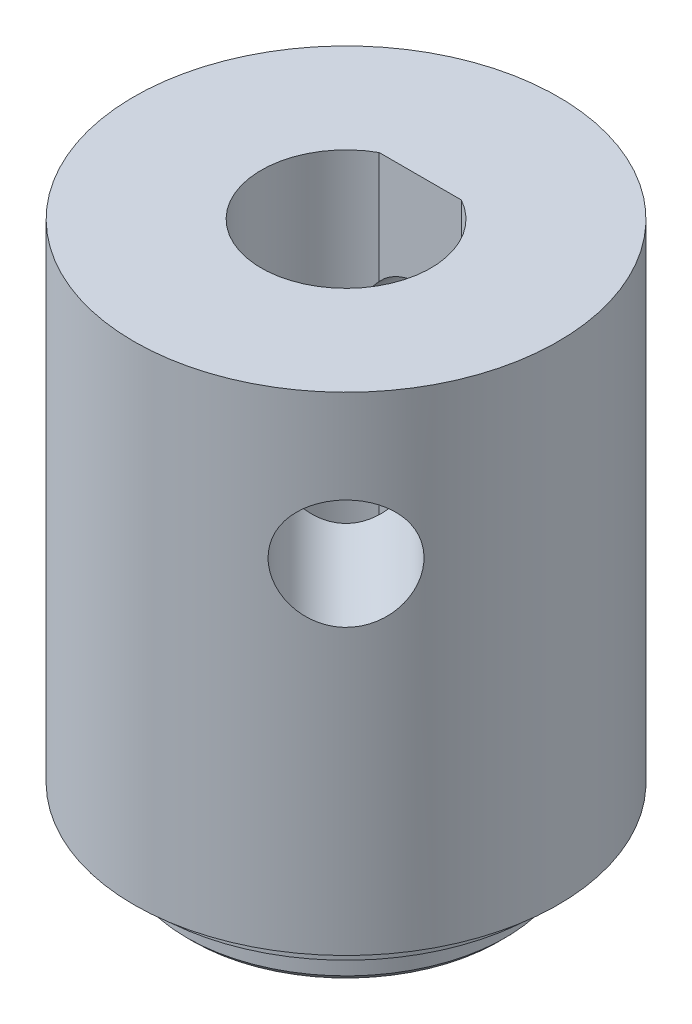
ISO-10303-21;
HEADER;
FILE_DESCRIPTION(('STEP AP214'),'2;1');
FILE_NAME('part.step','',(''),(''),'','','');
FILE_SCHEMA(('AUTOMOTIVE_DESIGN { 1 0 10303 214 1 1 1 1 }'));
ENDSEC;
DATA;
#1=APPLICATION_CONTEXT('core data for automotive mechanical design processes');
#2=APPLICATION_PROTOCOL_DEFINITION('international standard','automotive_design',2000,#1);
#3=PRODUCT_CONTEXT('',#1,'mechanical');
#4=PRODUCT('Part','Part','',(#3));
#5=PRODUCT_RELATED_PRODUCT_CATEGORY('part','',(#4));
#6=PRODUCT_DEFINITION_FORMATION('','',#4);
#7=PRODUCT_DEFINITION_CONTEXT('part definition',#1,'design');
#8=PRODUCT_DEFINITION('design','',#6,#7);
#9=PRODUCT_DEFINITION_SHAPE('','',#8);
#10=(LENGTH_UNIT() NAMED_UNIT(*) SI_UNIT(.MILLI.,.METRE.));
#11=(NAMED_UNIT(*) PLANE_ANGLE_UNIT() SI_UNIT($,.RADIAN.));
#12=(NAMED_UNIT(*) SI_UNIT($,.STERADIAN.) SOLID_ANGLE_UNIT());
#13=UNCERTAINTY_MEASURE_WITH_UNIT(LENGTH_MEASURE(1.E-05),#10,'distance_accuracy_value','');
#14=(GEOMETRIC_REPRESENTATION_CONTEXT(3) GLOBAL_UNCERTAINTY_ASSIGNED_CONTEXT((#13)) GLOBAL_UNIT_ASSIGNED_CONTEXT((#10,
#11,#12)) REPRESENTATION_CONTEXT('',''));
#15=CARTESIAN_POINT('',(0.,0.,0.));
#16=DIRECTION('',(0.,0.,1.));
#17=DIRECTION('',(1.,0.,0.));
#18=AXIS2_PLACEMENT_3D('',#15,#16,#17);
#19=CARTESIAN_POINT('',(-1.93649167310371,5.9,-3.5));
#20=DIRECTION('',(0.,0.,-1.));
#21=DIRECTION('',(-1.,0.,0.));
#22=AXIS2_PLACEMENT_3D('',#19,#20,#21);
#23=PLANE('',#22);
#24=DIRECTION('',(0.,1.,0.));
#25=VECTOR('',#24,1.);
#26=CARTESIAN_POINT('',(-1.93649167310371,5.9,-3.5));
#27=LINE('',#26,#25);
#28=CARTESIAN_POINT('',(-1.93649167310371,20.6349351572897,-3.5));
#29=VERTEX_POINT('',#28);
#30=CARTESIAN_POINT('',(-1.93649167310371,25.9,-3.5));
#31=VERTEX_POINT('',#30);
#32=EDGE_CURVE('E99',#29,#31,#27,.T.);
#33=ORIENTED_EDGE('',*,*,#32,.F.);
#34=CARTESIAN_POINT('',(0.,18.9,-3.5));
#35=DIRECTION('',(0.,0.,-1.));
#36=DIRECTION('',(-1.,0.,0.));
#37=AXIS2_PLACEMENT_3D('',#34,#35,#36);
#38=CIRCLE('',#37,2.6);
#39=CARTESIAN_POINT('',(1.93649167310371,20.6349351572897,-3.5));
#40=VERTEX_POINT('',#39);
#41=EDGE_CURVE('E85',#29,#40,#38,.T.);
#42=ORIENTED_EDGE('',*,*,#41,.T.);
#43=DIRECTION('',(0.,1.,0.));
#44=VECTOR('',#43,1.);
#45=CARTESIAN_POINT('',(1.93649167310371,5.9,-3.5));
#46=LINE('',#45,#44);
#47=CARTESIAN_POINT('',(1.93649167310371,25.9,-3.5));
#48=VERTEX_POINT('',#47);
#49=EDGE_CURVE('E60',#40,#48,#46,.T.);
#50=ORIENTED_EDGE('',*,*,#49,.T.);
#51=DIRECTION('',(-1.,0.,0.));
#52=VECTOR('',#51,1.);
#53=CARTESIAN_POINT('',(-1.93649167310371,25.9,-3.5));
#54=LINE('',#53,#52);
#55=EDGE_CURVE('E259',#48,#31,#54,.T.);
#56=ORIENTED_EDGE('',*,*,#55,.T.);
#57=EDGE_LOOP('',(#33,#42,#50,#56));
#58=FACE_BOUND('',#57,.T.);
#59=ADVANCED_FACE('F36',(#58),#23,.F.);
#60=CARTESIAN_POINT('',(0.,2.,0.));
#61=DIRECTION('',(0.,-1.,0.));
#62=DIRECTION('',(0.,0.,-1.));
#63=AXIS2_PLACEMENT_3D('',#60,#61,#62);
#64=CYLINDRICAL_SURFACE('',#63,7.5);
#65=CARTESIAN_POINT('',(0.,0.300000000000003,0.));
#66=DIRECTION('',(0.,1.,0.));
#67=DIRECTION('',(0.,0.,1.));
#68=AXIS2_PLACEMENT_3D('',#65,#66,#67);
#69=CIRCLE('',#68,7.5);
#70=CARTESIAN_POINT('',(0.,0.300000000000003,7.5));
#71=VERTEX_POINT('',#70);
#72=EDGE_CURVE('E45',#71,#71,#69,.T.);
#73=ORIENTED_EDGE('',*,*,#72,.T.);
#74=EDGE_LOOP('',(#73));
#75=FACE_BOUND('',#74,.T.);
#76=CARTESIAN_POINT('',(0.,2.,0.));
#77=DIRECTION('',(0.,1.,0.));
#78=DIRECTION('',(0.,0.,1.));
#79=AXIS2_PLACEMENT_3D('',#76,#77,#78);
#80=CIRCLE('',#79,7.5);
#81=CARTESIAN_POINT('',(0.,2.,7.5));
#82=VERTEX_POINT('',#81);
#83=EDGE_CURVE('E86',#82,#82,#80,.T.);
#84=ORIENTED_EDGE('',*,*,#83,.F.);
#85=EDGE_LOOP('',(#84));
#86=FACE_BOUND('',#85,.T.);
#87=ADVANCED_FACE('F205',(#75,#86),#64,.T.);
#88=CARTESIAN_POINT('',(0.,0.,0.));
#89=DIRECTION('',(0.,1.,0.));
#90=DIRECTION('',(0.,0.,1.));
#91=AXIS2_PLACEMENT_3D('',#88,#89,#90);
#92=PLANE('',#91);
#93=CARTESIAN_POINT('',(0.,0.,0.));
#94=DIRECTION('',(0.,1.,0.));
#95=DIRECTION('',(0.,0.,1.));
#96=AXIS2_PLACEMENT_3D('',#93,#94,#95);
#97=CIRCLE('',#96,7.2);
#98=CARTESIAN_POINT('',(0.,0.,7.2));
#99=VERTEX_POINT('',#98);
#100=EDGE_CURVE('E11',#99,#99,#97,.F.);
#101=ORIENTED_EDGE('',*,*,#100,.T.);
#102=EDGE_LOOP('',(#101));
#103=FACE_BOUND('',#102,.T.);
#104=CARTESIAN_POINT('',(4.,0.,0.));
#105=DIRECTION('',(0.,-1.,0.));
#106=DIRECTION('',(0.,0.,-1.));
#107=AXIS2_PLACEMENT_3D('',#104,#105,#106);
#108=CIRCLE('',#107,2.1);
#109=CARTESIAN_POINT('',(4.,0.,-2.1));
#110=VERTEX_POINT('',#109);
#111=EDGE_CURVE('E109',#110,#110,#108,.T.);
#112=ORIENTED_EDGE('',*,*,#111,.F.);
#113=EDGE_LOOP('',(#112));
#114=FACE_BOUND('',#113,.T.);
#115=CARTESIAN_POINT('',(-2.,0.,-3.46410161513776));
#116=DIRECTION('',(0.,-1.,0.));
#117=DIRECTION('',(0.,0.,-1.));
#118=AXIS2_PLACEMENT_3D('',#115,#116,#117);
#119=CIRCLE('',#118,2.1);
#120=CARTESIAN_POINT('',(-2.,0.,-5.56410161513776));
#121=VERTEX_POINT('',#120);
#122=EDGE_CURVE('E115',#121,#121,#119,.T.);
#123=ORIENTED_EDGE('',*,*,#122,.F.);
#124=EDGE_LOOP('',(#123));
#125=FACE_BOUND('',#124,.T.);
#126=CARTESIAN_POINT('',(-2.,0.,3.46410161513775));
#127=DIRECTION('',(0.,-1.,0.));
#128=DIRECTION('',(0.,0.,-1.));
#129=AXIS2_PLACEMENT_3D('',#126,#127,#128);
#130=CIRCLE('',#129,2.1);
#131=CARTESIAN_POINT('',(-2.,0.,1.36410161513775));
#132=VERTEX_POINT('',#131);
#133=EDGE_CURVE('E121',#132,#132,#130,.T.);
#134=ORIENTED_EDGE('',*,*,#133,.F.);
#135=EDGE_LOOP('',(#134));
#136=FACE_BOUND('',#135,.T.);
#137=ADVANCED_FACE('F202',(#103,#114,#125,#136),#92,.F.);
#138=CARTESIAN_POINT('',(0.,2.9,0.));
#139=DIRECTION('',(0.,-1.,0.));
#140=DIRECTION('',(0.,0.,-1.));
#141=AXIS2_PLACEMENT_3D('',#138,#139,#140);
#142=CYLINDRICAL_SURFACE('',#141,9.);
#143=CARTESIAN_POINT('',(0.,2.9,0.));
#144=DIRECTION('',(0.,1.,0.));
#145=DIRECTION('',(0.,0.,1.));
#146=AXIS2_PLACEMENT_3D('',#143,#144,#145);
#147=CIRCLE('',#146,9.);
#148=CARTESIAN_POINT('',(0.,2.9,9.));
#149=VERTEX_POINT('',#148);
#150=EDGE_CURVE('E130',#149,#149,#147,.T.);
#151=ORIENTED_EDGE('',*,*,#150,.F.);
#152=EDGE_LOOP('',(#151));
#153=FACE_BOUND('',#152,.T.);
#154=CARTESIAN_POINT('',(0.,2.,0.));
#155=DIRECTION('',(0.,1.,0.));
#156=DIRECTION('',(0.,0.,1.));
#157=AXIS2_PLACEMENT_3D('',#154,#155,#156);
#158=CIRCLE('',#157,9.);
#159=CARTESIAN_POINT('',(0.,2.,9.));
#160=VERTEX_POINT('',#159);
#161=EDGE_CURVE('E127',#160,#160,#158,.T.);
#162=ORIENTED_EDGE('',*,*,#161,.T.);
#163=EDGE_LOOP('',(#162));
#164=FACE_BOUND('',#163,.T.);
#165=ADVANCED_FACE('F198',(#153,#164),#142,.T.);
#166=CARTESIAN_POINT('',(0.,2.,0.));
#167=DIRECTION('',(0.,1.,0.));
#168=DIRECTION('',(0.,0.,1.));
#169=AXIS2_PLACEMENT_3D('',#166,#167,#168);
#170=PLANE('',#169);
#171=ORIENTED_EDGE('',*,*,#83,.T.);
#172=EDGE_LOOP('',(#171));
#173=FACE_BOUND('',#172,.T.);
#174=ORIENTED_EDGE('',*,*,#161,.F.);
#175=EDGE_LOOP('',(#174));
#176=FACE_BOUND('',#175,.T.);
#177=ADVANCED_FACE('F192',(#173,#176),#170,.F.);
#178=CARTESIAN_POINT('',(0.,25.9,0.));
#179=DIRECTION('',(0.,-1.,0.));
#180=DIRECTION('',(0.,0.,-1.));
#181=AXIS2_PLACEMENT_3D('',#178,#179,#180);
#182=CYLINDRICAL_SURFACE('',#181,10.);
#183=CARTESIAN_POINT('',(7.07106781186544,21.5,7.07106781186551));
#184=CARTESIAN_POINT('',(7.17250883846086,21.4999963317231,6.96962355838698));
#185=CARTESIAN_POINT('',(7.27177679064812,21.4880863541353,6.86594971398938));
#186=CARTESIAN_POINT('',(7.46322731948612,21.4408401503296,6.65735069355482));
#187=CARTESIAN_POINT('',(7.55540621283121,21.4054918366635,6.55242489930377));
#188=CARTESIAN_POINT('',(7.73046634046129,21.3125893881236,6.34494306025288));
#189=CARTESIAN_POINT('',(7.81335906217048,21.2550630888212,6.24238421503274));
#190=CARTESIAN_POINT('',(7.9685841058329,21.119538693623,6.04298390502567));
#191=CARTESIAN_POINT('',(8.04091586337656,21.0415395042172,5.94614274597362));
#192=CARTESIAN_POINT('',(8.17551301916066,20.8654601813591,5.75972928751891));
#193=CARTESIAN_POINT('',(8.23754960206298,20.7670115214125,5.67033986019945));
#194=CARTESIAN_POINT('',(8.34930778285027,20.5536161416951,5.50446045579447));
#195=CARTESIAN_POINT('',(8.39902787702357,20.4386674101452,5.42797205414976));
#196=CARTESIAN_POINT('',(8.48663274255684,20.193237022512,5.28997867776505));
#197=CARTESIAN_POINT('',(8.52431243161059,20.0625336354661,5.22873689974431));
#198=CARTESIAN_POINT('',(8.5865958958179,19.790719184103,5.12581843774078));
#199=CARTESIAN_POINT('',(8.6112019504551,19.6496099390124,5.08413834318355));
#200=CARTESIAN_POINT('',(8.64689092605531,19.3642041010566,5.02319712764596));
#201=CARTESIAN_POINT('',(8.65825389995891,19.2200417690649,5.00347214059314));
#202=CARTESIAN_POINT('',(8.66837329053581,18.929963539972,4.98592174485262));
#203=CARTESIAN_POINT('',(8.6671319375892,18.7840479576789,4.98809246164245));
#204=CARTESIAN_POINT('',(8.65225209063401,18.4986805743318,5.01385424104119));
#205=CARTESIAN_POINT('',(8.63894151879201,18.3591598041771,5.03687868678075));
#206=CARTESIAN_POINT('',(8.60041614962645,18.0864804209399,5.10237903855316));
#207=CARTESIAN_POINT('',(8.57520044285236,17.9533222947649,5.14485643061736));
#208=CARTESIAN_POINT('',(8.51258869011589,17.6954800570663,5.24780745052148));
#209=CARTESIAN_POINT('',(8.47506400766528,17.5709030257153,5.30847052715643));
#210=CARTESIAN_POINT('',(8.38801872682828,17.3349435602546,5.44496802473012));
#211=CARTESIAN_POINT('',(8.33849587283767,17.2235636130092,5.52080529788466));
#212=CARTESIAN_POINT('',(8.2259510439472,17.0135415603956,5.68718766835645));
#213=CARTESIAN_POINT('',(8.16255881763623,16.9154001785762,5.77811522416136));
#214=CARTESIAN_POINT('',(8.02375207392205,16.7387102616642,5.96936704752652));
#215=CARTESIAN_POINT('',(7.94833712801203,16.6601624251693,6.06969164995829));
#216=CARTESIAN_POINT('',(7.78611568186203,16.5246838384352,6.27644113985493));
#217=CARTESIAN_POINT('',(7.69926525718852,16.4678399164137,6.38288860948054));
#218=CARTESIAN_POINT('',(7.51603970187289,16.3780790019277,6.59765433057864));
#219=CARTESIAN_POINT('',(7.41966655126226,16.3451570472841,6.70597218929759));
#220=CARTESIAN_POINT('',(7.22253276302966,16.3049520362114,6.91775767531798));
#221=CARTESIAN_POINT('',(7.12196608919987,16.2969877607876,7.02127671976095));
#222=CARTESIAN_POINT('',(6.91691340264543,16.3050481541739,7.22336657568446));
#223=CARTESIAN_POINT('',(6.8124277745643,16.3210704746868,7.32193787057527));
#224=CARTESIAN_POINT('',(6.60453123438099,16.3760893151325,7.50996071224377));
#225=CARTESIAN_POINT('',(6.50113035137588,16.4147092622615,7.59953417676974));
#226=CARTESIAN_POINT('',(6.2970462457218,16.5133927029992,7.76948257108771));
#227=CARTESIAN_POINT('',(6.19636331104212,16.5734584592955,7.84985652908322));
#228=CARTESIAN_POINT('',(5.99923116073154,16.714615019021,8.00156238100029));
#229=CARTESIAN_POINT('',(5.9028975584451,16.7960808785712,8.07269522398271));
#230=CARTESIAN_POINT('',(5.71996899705971,16.9772504433254,8.20332926125803));
#231=CARTESIAN_POINT('',(5.63337586777149,17.0769575660596,8.26282827160505));
#232=CARTESIAN_POINT('',(5.47106938966893,17.2949522056671,8.37121222166336));
#233=CARTESIAN_POINT('',(5.39570835266209,17.4136648160493,8.41977126912049));
#234=CARTESIAN_POINT('',(5.26199817309709,17.6645060665079,8.50397806782414));
#235=CARTESIAN_POINT('',(5.20364829696105,17.7966341277341,8.53962637584078));
#236=CARTESIAN_POINT('',(5.10706190148137,18.0698722097096,8.5977379216066));
#237=CARTESIAN_POINT('',(5.0687073428104,18.2109238760307,8.62027863143806));
#238=CARTESIAN_POINT('',(5.01361704327446,18.4986034296297,8.65243785915293));
#239=CARTESIAN_POINT('',(4.99687610717235,18.6452299681567,8.66205948240191));
#240=CARTESIAN_POINT('',(4.9861044260617,18.9349996674078,8.66826365511637));
#241=CARTESIAN_POINT('',(4.99138282379063,19.0781091440358,8.66524285131164));
#242=CARTESIAN_POINT('',(5.02280770964664,19.3612225306755,8.64706456386805));
#243=CARTESIAN_POINT('',(5.04895371011688,19.5012265131812,8.63190736384566));
#244=CARTESIAN_POINT('',(5.12051522284117,19.7732405538469,8.58964604974523));
#245=CARTESIAN_POINT('',(5.16579510174414,19.9052995449596,8.56262597585495));
#246=CARTESIAN_POINT('',(5.27348547913401,20.1590636608092,8.4967239814845));
#247=CARTESIAN_POINT('',(5.33589854102361,20.2807672326347,8.45784028591657));
#248=CARTESIAN_POINT('',(5.47717560524849,20.5140549345385,8.36706481975059));
#249=CARTESIAN_POINT('',(5.5564522773556,20.6252590286834,8.31483849249491));
#250=CARTESIAN_POINT('',(5.72712437549845,20.8307349495758,8.19821385738191));
#251=CARTESIAN_POINT('',(5.81852271327212,20.9250026952021,8.13381262341136));
#252=CARTESIAN_POINT('',(6.01191219324978,21.0957802922383,7.99196843813032));
#253=CARTESIAN_POINT('',(6.1140788484513,21.1718966071839,7.91429008664744));
#254=CARTESIAN_POINT('',(6.32357066212358,21.3015495987193,7.74792159439445));
#255=CARTESIAN_POINT('',(6.43089229736211,21.3551014593616,7.65923891083502));
#256=CARTESIAN_POINT('',(6.62807214462796,21.4307254735429,7.48883178863139));
#257=CARTESIAN_POINT('',(6.71773348075081,21.4566448140635,7.408565013898));
#258=CARTESIAN_POINT('',(6.89581645783913,21.4912828849897,7.2430989895666));
#259=CARTESIAN_POINT('',(6.98423820799026,21.5000031399035,7.1579001778281));
#260=CARTESIAN_POINT('',(7.07106781186544,21.5,7.07106781186551));
#261=B_SPLINE_CURVE_WITH_KNOTS('',3,(#183,#184,#185,#186,#187,#188,#189,#190,#191,#192,#193,
#194,#195,#196,#197,#198,#199,#200,#201,#202,#203,#204,#205,#206,#207,#208,#209,#210,#211,#212,
#213,#214,#215,#216,#217,#218,#219,#220,#221,#222,#223,#224,#225,#226,#227,#228,#229,#230,#231,
#232,#233,#234,#235,#236,#237,#238,#239,#240,#241,#242,#243,#244,#245,#246,#247,#248,#249,#250,
#251,#252,#253,#254,#255,#256,#257,#258,#259,#260),.UNSPECIFIED.,.T.,.F.,(4,2,2,2,2,2,2,2,2,2,2,
2,2,2,2,2,2,2,2,2,2,2,2,2,2,2,2,2,2,2,2,2,2,2,2,2,2,2,4),(0.,0.42993447406683,0.860090843440721,
1.2897090723579,1.71935025296284,2.15753633720073,2.59577589293958,3.04112475628265,
3.48639594429567,3.92206951869645,4.35766600046568,4.78177068780134,5.20590777835264,
5.63462664248516,6.06342616653083,6.50549258454899,6.94757476196668,7.39140744168554,
7.8351480300438,8.26666626217952,8.69814225126951,9.12262491558317,9.54715237912455,
9.97968392093793,10.4122965813725,10.856462519252,11.3006093003833,11.7421035592481,
12.1834916769672,12.6111370956013,13.0387725208446,13.4634261367134,13.888143322328,
14.3247845723567,14.7615308983276,15.2070257711669,15.652220381372,16.0202603229323,
16.38826764037),.UNSPECIFIED.);
#262=CARTESIAN_POINT('',(7.07106781186544,21.5,7.07106781186551));
#263=VERTEX_POINT('',#262);
#264=EDGE_CURVE('E156',#263,#263,#261,.T.);
#265=ORIENTED_EDGE('',*,*,#264,.T.);
#266=EDGE_LOOP('',(#265));
#267=FACE_BOUND('',#266,.T.);
#268=CARTESIAN_POINT('',(0.,21.5,-10.));
#269=CARTESIAN_POINT('',(-0.143461557343221,21.4999963317231,-9.99999771824907));
#270=CARTESIAN_POINT('',(-0.28696307789456,21.4880863541353,-9.99688228198996));
#271=CARTESIAN_POINT('',(-0.569840826995814,21.4408401503296,-9.98475646729491));
#272=CARTESIAN_POINT('',(-0.709214888198693,21.4054918366635,-9.9757430472252));
#273=CARTESIAN_POINT('',(-0.97971290692725,21.3125893881236,-9.95281743522186));
#274=CARTESIAN_POINT('',(-1.11084696748465,21.2550630888212,-9.93891138592762));
#275=CARTESIAN_POINT('',(-1.36160495984502,21.119538693623,-9.90767475553459));
#276=CARTESIAN_POINT('',(-1.48122827636296,21.0415395042172,-9.89034399152519));
#277=CARTESIAN_POINT('',(-1.70821705852408,20.8654601813591,-9.85370433253079));
#278=CARTESIAN_POINT('',(-1.81529141719992,20.7670115214125,-9.83436295075869));
#279=CARTESIAN_POINT('',(-2.01161083640164,20.5536161416951,-9.7960934665325));
#280=CARTESIAN_POINT('',(-2.1008537196379,20.4386674101452,-9.77716541479858));
#281=CARTESIAN_POINT('',(-2.26037576632186,20.193237022512,-9.74153535708163));
#282=CARTESIAN_POINT('',(-2.33032380649516,20.0625336354661,-9.72487444419415));
#283=CARTESIAN_POINT('',(-2.44713920878393,19.790719184103,-9.69614116169894));
#284=CARTESIAN_POINT('',(-2.49401059437805,19.6496099390124,-9.68406799228924));
#285=CARTESIAN_POINT('',(-2.56233845779894,19.3642041010566,-9.66621196218937));
#286=CARTESIAN_POINT('',(-2.58432096580448,19.2200417690649,-9.66029912598719));
#287=CARTESIAN_POINT('',(-2.60388645934352,18.9299635399721,-9.65504461184495));
#288=CARTESIAN_POINT('',(-2.601473761695,18.7840479576789,-9.65570177132069));
#289=CARTESIAN_POINT('',(-2.57273579210169,18.4986805743318,-9.66339645954394));
#290=CARTESIAN_POINT('',(-2.54704305477524,18.3591598041771,-9.67026520564849));
#291=CARTESIAN_POINT('',(-2.47348576208218,18.0864804209399,-9.68933939877218));
#292=CARTESIAN_POINT('',(-2.42561951285409,17.9533222947649,-9.70154525349553));
#293=CARTESIAN_POINT('',(-2.30854895360788,17.6954800570663,-9.73006942285787));
#294=CARTESIAN_POINT('',(-2.23911972332897,17.5709030257153,-9.74643073829138));
#295=CARTESIAN_POINT('',(-2.08105110882949,17.3349435602546,-9.7813987360906));
#296=CARTESIAN_POINT('',(-1.99240811283474,17.2235636130092,-9.80000584032441));
#297=CARTESIAN_POINT('',(-1.79517679870832,17.0135415603956,-9.83807473105897));
#298=CARTESIAN_POINT('',(-1.68605623430295,16.9154001785762,-9.85754514926634));
#299=CARTESIAN_POINT('',(-1.45266958333244,16.7387102616642,-9.89462942072742));
#300=CARTESIAN_POINT('',(-1.32840295697729,16.6601624251693,-9.91224320777098));
#301=CARTESIAN_POINT('',(-1.06750110603797,16.5246838384352,-9.9437292894572));
#302=CARTESIAN_POINT('',(-0.93081885418998,16.4678399164137,-9.95758649283405));
#303=CARTESIAN_POINT('',(-0.649396523784739,16.3780790019277,-9.97988875793858));
#304=CARTESIAN_POINT('',(-0.504658123039876,16.3451570472841,-9.98833494204127));
#305=CARTESIAN_POINT('',(-0.215508531257709,16.3049520362114,-9.99869525690292));
#306=CARTESIAN_POINT('',(-0.0711981359237112,16.2969877607876,-10.0007828981841));
#307=CARTESIAN_POINT('',(0.216695116771979,16.3050481541739,-9.99868786055344));
#308=CARTESIAN_POINT('',(0.360278043972314,16.3210704746868,-9.99450579544836));
#309=CARTESIAN_POINT('',(0.640235323682918,16.3760893151325,-9.98045296846128));
#310=CARTESIAN_POINT('',(0.776688793417193,16.4147092622615,-9.97067550708838));
#311=CARTESIAN_POINT('',(1.04116971053158,16.5133927029992,-9.94653791412199));
#312=CARTESIAN_POINT('',(1.16919626712278,16.5734584592955,-9.93217729898966));
#313=CARTESIAN_POINT('',(1.41586198403352,16.714615019021,-9.9000560553514));
#314=CARTESIAN_POINT('',(1.53427864310433,16.7960808785712,-9.88223642755649));
#315=CARTESIAN_POINT('',(1.75600088294379,16.9772504433254,-9.84525861493933));
#316=CARTESIAN_POINT('',(1.85930362555793,17.0769575660596,-9.82610017970574));
#317=CARTESIAN_POINT('',(2.05071066291277,17.2949522056671,-9.78797119446692));
#318=CARTESIAN_POINT('',(2.13833539496246,17.4136648160493,-9.76901932590703));
#319=CARTESIAN_POINT('',(2.29242596803189,17.6645060665079,-9.73401514960831));
#320=CARTESIAN_POINT('',(2.35889272146548,17.7966341277341,-9.71796271684751));
#321=CARTESIAN_POINT('',(2.46828068475577,18.0698722097096,-9.69075688970971));
#322=CARTESIAN_POINT('',(2.51134014205601,18.2109238760307,-9.67957480995864));
#323=CARTESIAN_POINT('',(2.57303487443038,18.4986034296297,-9.66336009357408));
#324=CARTESIAN_POINT('',(2.59167601891697,18.6452299681567,-9.65832597917824));
#325=CARTESIAN_POINT('',(2.60367976027314,18.9349996674078,-9.65509626301817));
#326=CARTESIAN_POINT('',(2.59781133859025,19.0781091440358,-9.65669262299114));
#327=CARTESIAN_POINT('',(2.56273659838173,19.3612225306755,-9.66605938255622));
#328=CARTESIAN_POINT('',(2.53353082522869,19.5012265131812,-9.67382963787));
#329=CARTESIAN_POINT('',(2.45304593252711,19.7732405538469,-9.69454800700704));
#330=CARTESIAN_POINT('',(2.40192214562752,19.9052995449596,-9.70745963895466));
#331=CARTESIAN_POINT('',(2.27917380239356,20.1590636608092,-9.73700848796251));
#332=CARTESIAN_POINT('',(2.20754617828312,20.2807672326347,-9.75364626244559));
#333=CARTESIAN_POINT('',(2.04346026045225,20.5140549345385,-9.78935628489379));
#334=CARTESIAN_POINT('',(1.95047359785645,20.6252590286834,-9.80848376717167));
#335=CARTESIAN_POINT('',(1.74732412955849,20.8307349495758,-9.846701094786));
#336=CARTESIAN_POINT('',(1.6371571958722,20.9250026952021,-9.86579092995759));
#337=CARTESIAN_POINT('',(1.40011119788575,21.0957802922383,-9.90223895737583));
#338=CARTESIAN_POINT('',(1.27294157409667,21.1718966071839,-9.91955480299503));
#339=CARTESIAN_POINT('',(1.00716820299806,21.3015495987193,-9.9500475959979));
#340=CARTESIAN_POINT('',(0.868572220034173,21.3551014593616,-9.96322732512439));
#341=CARTESIAN_POINT('',(0.608648981246489,21.4307254735429,-9.98215850056674));
#342=CARTESIAN_POINT('',(0.488491661745831,21.4566448140635,-9.9888014586315));
#343=CARTESIAN_POINT('',(0.245565833172073,21.4912828849897,-9.99772299148383));
#344=CARTESIAN_POINT('',(0.122797556506497,21.5000031399035,-10.0000019530907));
#345=CARTESIAN_POINT('',(0.,21.5,-10.));
#346=B_SPLINE_CURVE_WITH_KNOTS('',3,(#268,#269,#270,#271,#272,#273,#274,#275,#276,#277,#278,
#279,#280,#281,#282,#283,#284,#285,#286,#287,#288,#289,#290,#291,#292,#293,#294,#295,#296,#297,
#298,#299,#300,#301,#302,#303,#304,#305,#306,#307,#308,#309,#310,#311,#312,#313,#314,#315,#316,
#317,#318,#319,#320,#321,#322,#323,#324,#325,#326,#327,#328,#329,#330,#331,#332,#333,#334,#335,
#336,#337,#338,#339,#340,#341,#342,#343,#344,#345),.UNSPECIFIED.,.T.,.F.,(4,2,2,2,2,2,2,2,2,2,2,
2,2,2,2,2,2,2,2,2,2,2,2,2,2,2,2,2,2,2,2,2,2,2,2,2,2,2,4),(0.,0.42993447406683,0.860090843440721,
1.2897090723579,1.71935025296284,2.15753633720073,2.59577589293958,3.04112475628265,
3.48639594429567,3.92206951869644,4.35766600046568,4.78177068780134,5.20590777835264,
5.63462664248516,6.06342616653083,6.50549258454899,6.94757476196668,7.39140744168554,
7.8351480300438,8.26666626217952,8.69814225126951,9.12262491558317,9.54715237912455,
9.97968392093793,10.4122965813725,10.856462519252,11.3006093003833,11.7421035592481,
12.1834916769672,12.6111370956013,13.0387725208446,13.4634261367134,13.888143322328,
14.3247845723567,14.7615308983275,15.2070257711669,15.652220381372,16.0202603229323,
16.38826764037),.UNSPECIFIED.);
#347=CARTESIAN_POINT('',(0.,21.5,-10.));
#348=VERTEX_POINT('',#347);
#349=EDGE_CURVE('E93',#348,#348,#346,.T.);
#350=ORIENTED_EDGE('',*,*,#349,.T.);
#351=EDGE_LOOP('',(#350));
#352=FACE_BOUND('',#351,.T.);
#353=CARTESIAN_POINT('',(0.,25.9,0.));
#354=DIRECTION('',(0.,1.,0.));
#355=DIRECTION('',(0.,0.,1.));
#356=AXIS2_PLACEMENT_3D('',#353,#354,#355);
#357=CIRCLE('',#356,10.);
#358=CARTESIAN_POINT('',(0.,25.9,10.));
#359=VERTEX_POINT('',#358);
#360=EDGE_CURVE('E124',#359,#359,#357,.T.);
#361=ORIENTED_EDGE('',*,*,#360,.F.);
#362=EDGE_LOOP('',(#361));
#363=FACE_BOUND('',#362,.T.);
#364=CARTESIAN_POINT('',(0.,2.9,0.));
#365=DIRECTION('',(0.,1.,0.));
#366=DIRECTION('',(0.,0.,1.));
#367=AXIS2_PLACEMENT_3D('',#364,#365,#366);
#368=CIRCLE('',#367,10.);
#369=CARTESIAN_POINT('',(0.,2.9,10.));
#370=VERTEX_POINT('',#369);
#371=EDGE_CURVE('E108',#370,#370,#368,.T.);
#372=ORIENTED_EDGE('',*,*,#371,.T.);
#373=EDGE_LOOP('',(#372));
#374=FACE_BOUND('',#373,.T.);
#375=ADVANCED_FACE('F186',(#267,#352,#363,#374),#182,.T.);
#376=CARTESIAN_POINT('',(0.,25.9,0.));
#377=DIRECTION('',(0.,1.,0.));
#378=DIRECTION('',(0.,0.,1.));
#379=AXIS2_PLACEMENT_3D('',#376,#377,#378);
#380=PLANE('',#379);
#381=CARTESIAN_POINT('',(0.,25.9,0.));
#382=DIRECTION('',(0.,1.,0.));
#383=DIRECTION('',(0.,0.,1.));
#384=AXIS2_PLACEMENT_3D('',#381,#382,#383);
#385=CIRCLE('',#384,4.);
#386=EDGE_CURVE('E183',#31,#48,#385,.T.);
#387=ORIENTED_EDGE('',*,*,#386,.F.);
#388=ORIENTED_EDGE('',*,*,#55,.F.);
#389=EDGE_LOOP('',(#387,#388));
#390=FACE_BOUND('',#389,.T.);
#391=ORIENTED_EDGE('',*,*,#360,.T.);
#392=EDGE_LOOP('',(#391));
#393=FACE_BOUND('',#392,.T.);
#394=ADVANCED_FACE('F191',(#390,#393),#380,.T.);
#395=CARTESIAN_POINT('',(0.,2.9,0.));
#396=DIRECTION('',(0.,1.,0.));
#397=DIRECTION('',(0.,0.,1.));
#398=AXIS2_PLACEMENT_3D('',#395,#396,#397);
#399=PLANE('',#398);
#400=ORIENTED_EDGE('',*,*,#150,.T.);
#401=EDGE_LOOP('',(#400));
#402=FACE_BOUND('',#401,.T.);
#403=ORIENTED_EDGE('',*,*,#371,.F.);
#404=EDGE_LOOP('',(#403));
#405=FACE_BOUND('',#404,.T.);
#406=ADVANCED_FACE('F194',(#402,#405),#399,.F.);
#407=CARTESIAN_POINT('',(-2.,5.5,3.46410161513775));
#408=DIRECTION('',(0.,-1.,0.));
#409=DIRECTION('',(0.,0.,-1.));
#410=AXIS2_PLACEMENT_3D('',#407,#408,#409);
#411=CYLINDRICAL_SURFACE('',#410,2.1);
#412=CARTESIAN_POINT('',(-2.,5.5,3.46410161513775));
#413=DIRECTION('',(0.,-1.,0.));
#414=DIRECTION('',(0.,0.,-1.));
#415=AXIS2_PLACEMENT_3D('',#412,#413,#414);
#416=CIRCLE('',#415,2.1);
#417=CARTESIAN_POINT('',(-2.,5.5,1.36410161513775));
#418=VERTEX_POINT('',#417);
#419=EDGE_CURVE('E118',#418,#418,#416,.T.);
#420=ORIENTED_EDGE('',*,*,#419,.F.);
#421=EDGE_LOOP('',(#420));
#422=FACE_BOUND('',#421,.T.);
#423=ORIENTED_EDGE('',*,*,#133,.T.);
#424=EDGE_LOOP('',(#423));
#425=FACE_BOUND('',#424,.T.);
#426=ADVANCED_FACE('F232',(#422,#425),#411,.F.);
#427=CARTESIAN_POINT('',(-2.,5.5,3.46410161513775));
#428=DIRECTION('',(0.,-1.,0.));
#429=DIRECTION('',(0.,0.,-1.));
#430=AXIS2_PLACEMENT_3D('',#427,#428,#429);
#431=PLANE('',#430);
#432=ORIENTED_EDGE('',*,*,#419,.T.);
#433=EDGE_LOOP('',(#432));
#434=FACE_BOUND('',#433,.T.);
#435=ADVANCED_FACE('F234',(#434),#431,.T.);
#436=CARTESIAN_POINT('',(-2.,5.5,-3.46410161513776));
#437=DIRECTION('',(0.,-1.,0.));
#438=DIRECTION('',(0.,0.,-1.));
#439=AXIS2_PLACEMENT_3D('',#436,#437,#438);
#440=CYLINDRICAL_SURFACE('',#439,2.1);
#441=CARTESIAN_POINT('',(-2.,5.5,-3.46410161513776));
#442=DIRECTION('',(0.,-1.,0.));
#443=DIRECTION('',(0.,0.,-1.));
#444=AXIS2_PLACEMENT_3D('',#441,#442,#443);
#445=CIRCLE('',#444,2.1);
#446=CARTESIAN_POINT('',(-2.,5.5,-5.56410161513776));
#447=VERTEX_POINT('',#446);
#448=EDGE_CURVE('E112',#447,#447,#445,.T.);
#449=ORIENTED_EDGE('',*,*,#448,.F.);
#450=EDGE_LOOP('',(#449));
#451=FACE_BOUND('',#450,.T.);
#452=ORIENTED_EDGE('',*,*,#122,.T.);
#453=EDGE_LOOP('',(#452));
#454=FACE_BOUND('',#453,.T.);
#455=ADVANCED_FACE('F241',(#451,#454),#440,.F.);
#456=CARTESIAN_POINT('',(-2.,5.5,-3.46410161513776));
#457=DIRECTION('',(0.,-1.,0.));
#458=DIRECTION('',(0.,0.,-1.));
#459=AXIS2_PLACEMENT_3D('',#456,#457,#458);
#460=PLANE('',#459);
#461=ORIENTED_EDGE('',*,*,#448,.T.);
#462=EDGE_LOOP('',(#461));
#463=FACE_BOUND('',#462,.T.);
#464=ADVANCED_FACE('F282',(#463),#460,.T.);
#465=CARTESIAN_POINT('',(4.,5.5,0.));
#466=DIRECTION('',(0.,-1.,0.));
#467=DIRECTION('',(0.,0.,-1.));
#468=AXIS2_PLACEMENT_3D('',#465,#466,#467);
#469=CYLINDRICAL_SURFACE('',#468,2.1);
#470=CARTESIAN_POINT('',(4.,5.5,0.));
#471=DIRECTION('',(0.,-1.,0.));
#472=DIRECTION('',(0.,0.,-1.));
#473=AXIS2_PLACEMENT_3D('',#470,#471,#472);
#474=CIRCLE('',#473,2.1);
#475=CARTESIAN_POINT('',(4.,5.5,-2.1));
#476=VERTEX_POINT('',#475);
#477=EDGE_CURVE('E105',#476,#476,#474,.T.);
#478=ORIENTED_EDGE('',*,*,#477,.F.);
#479=EDGE_LOOP('',(#478));
#480=FACE_BOUND('',#479,.T.);
#481=ORIENTED_EDGE('',*,*,#111,.T.);
#482=EDGE_LOOP('',(#481));
#483=FACE_BOUND('',#482,.T.);
#484=ADVANCED_FACE('F275',(#480,#483),#469,.F.);
#485=CARTESIAN_POINT('',(4.,5.5,0.));
#486=DIRECTION('',(0.,-1.,0.));
#487=DIRECTION('',(0.,0.,-1.));
#488=AXIS2_PLACEMENT_3D('',#485,#486,#487);
#489=PLANE('',#488);
#490=ORIENTED_EDGE('',*,*,#477,.T.);
#491=EDGE_LOOP('',(#490));
#492=FACE_BOUND('',#491,.T.);
#493=ADVANCED_FACE('F270',(#492),#489,.T.);
#494=CARTESIAN_POINT('',(0.,5.9,0.));
#495=DIRECTION('',(0.,1.,0.));
#496=DIRECTION('',(0.,0.,1.));
#497=AXIS2_PLACEMENT_3D('',#494,#495,#496);
#498=CYLINDRICAL_SURFACE('',#497,4.);
#499=CARTESIAN_POINT('',(0.31094089493542,18.9,3.98789615710549));
#500=CARTESIAN_POINT('',(0.31093704324673,18.8360209121811,3.98789521939617));
#501=CARTESIAN_POINT('',(0.314048519104845,18.7720599661198,3.98765772042656));
#502=CARTESIAN_POINT('',(0.326363512598078,18.6447244215952,3.9866681090698));
#503=CARTESIAN_POINT('',(0.335568613956911,18.5813499799064,3.98591586289895));
#504=CARTESIAN_POINT('',(0.371970071852898,18.3927882937235,3.98274594209236));
#505=CARTESIAN_POINT('',(0.407952099378546,18.2692358014002,3.97941490511049));
#506=CARTESIAN_POINT('',(0.499020417941417,18.0310978237061,3.96900644104441));
#507=CARTESIAN_POINT('',(0.553931890271695,17.9164416547035,3.96196299469279));
#508=CARTESIAN_POINT('',(0.678838650677286,17.6962383026776,3.94248365228626));
#509=CARTESIAN_POINT('',(0.748837288887258,17.5906931500751,3.93004655793949));
#510=CARTESIAN_POINT('',(0.911620663609537,17.3747621499519,3.89574435514651));
#511=CARTESIAN_POINT('',(1.00624166787864,17.2659373672869,3.87276386542984));
#512=CARTESIAN_POINT('',(1.20660735391478,17.0624507553227,3.81510315219632));
#513=CARTESIAN_POINT('',(1.31236209046131,16.9678019183142,3.78041228968013));
#514=CARTESIAN_POINT('',(1.54617376698172,16.782648820814,3.69146838051052));
#515=CARTESIAN_POINT('',(1.67531716465689,16.6944145113367,3.63521168821283));
#516=CARTESIAN_POINT('',(1.87172000658959,16.5801501218722,3.53582928617114));
#517=CARTESIAN_POINT('',(1.93765400053239,16.5450693777304,3.5001904440776));
#518=CARTESIAN_POINT('',(2.06966316439138,16.4814038441397,3.42378306584095));
#519=CARTESIAN_POINT('',(2.13573819725198,16.4528143622988,3.38301826847509));
#520=CARTESIAN_POINT('',(2.2601150986475,16.4053084952206,3.30103321079139));
#521=CARTESIAN_POINT('',(2.31848947100005,16.3856828963229,3.26033232953474));
#522=CARTESIAN_POINT('',(2.43400515330377,16.3523026462423,3.17502273837885));
#523=CARTESIAN_POINT('',(2.49114718235231,16.3385444781747,3.13041638876371));
#524=CARTESIAN_POINT('',(2.60354225990025,16.3171373369831,3.03757676215039));
#525=CARTESIAN_POINT('',(2.65879662043383,16.3094840344004,2.9893460820694));
#526=CARTESIAN_POINT('',(2.76681729877859,16.3004082856814,2.88966009214489));
#527=CARTESIAN_POINT('',(2.81958393938157,16.298985028958,2.83820520268482));
#528=CARTESIAN_POINT('',(2.95844724101481,16.3036381040523,2.69505962687388));
#529=CARTESIAN_POINT('',(3.04167734327734,16.3157408342669,2.60068567131244));
#530=CARTESIAN_POINT('',(3.19711904169283,16.3576379441745,2.40705031160582));
#531=CARTESIAN_POINT('',(3.26932981721454,16.3874336406904,2.30778854418293));
#532=CARTESIAN_POINT('',(3.40175482237697,16.4632061685132,2.10771026606137));
#533=CARTESIAN_POINT('',(3.46198298860654,16.5091640278201,2.00689571021313));
#534=CARTESIAN_POINT('',(3.57060803280705,16.6155096305193,1.80658872478854));
#535=CARTESIAN_POINT('',(3.61900255246374,16.6759002454654,1.70709656248036));
#536=CARTESIAN_POINT('',(3.71026481323996,16.8180713792258,1.4994633305902));
#537=CARTESIAN_POINT('',(3.7516172038207,16.9016052861686,1.39185942721365));
#538=CARTESIAN_POINT('',(3.82201480330493,17.0831582830263,1.18497939610654));
#539=CARTESIAN_POINT('',(3.85104103839383,17.1811993935415,1.0857162945051));
#540=CARTESIAN_POINT('',(3.90228822084022,17.4056207261566,0.8855964656709));
#541=CARTESIAN_POINT('',(3.92290544092796,17.534048745502,0.786607618115118));
#542=CARTESIAN_POINT('',(3.95406454227132,17.806476272475,0.611013150975914));
#543=CARTESIAN_POINT('',(3.96462431219305,17.950447624072,0.534367959079866));
#544=CARTESIAN_POINT('',(3.97722446562911,18.2095635607807,0.428604847761319));
#545=CARTESIAN_POINT('',(3.98081424820512,18.3216507758935,0.392203220449805));
#546=CARTESIAN_POINT('',(3.98574447792923,18.5503023792615,0.338510125051601));
#547=CARTESIAN_POINT('',(3.98708849077114,18.6668593690596,0.321188378048495));
#548=CARTESIAN_POINT('',(3.98817375335866,18.9016367018179,0.307454772761549));
#549=CARTESIAN_POINT('',(3.98790949755705,19.0198613746466,0.311114738183359));
#550=CARTESIAN_POINT('',(3.9856240209297,19.2538589217206,0.339087691852366));
#551=CARTESIAN_POINT('',(3.98360133361844,19.3696296668821,0.363417918166556));
#552=CARTESIAN_POINT('',(3.97705141027882,19.5916641205735,0.429053556211221));
#553=CARTESIAN_POINT('',(3.97261391900538,19.6981185456727,0.469737800425709));
#554=CARTESIAN_POINT('',(3.96018003103999,19.9043067277335,0.565047285432696));
#555=CARTESIAN_POINT('',(3.95218246075491,20.0040382559739,0.61967712090546));
#556=CARTESIAN_POINT('',(3.92935625265663,20.2149047870133,0.75199640387326));
#557=CARTESIAN_POINT('',(3.91349080933707,20.3244046807182,0.832109067917348));
#558=CARTESIAN_POINT('',(3.87285193874786,20.5317208709071,1.00442752238649));
#559=CARTESIAN_POINT('',(3.84806771835566,20.6295228191428,1.09664787876532));
#560=CARTESIAN_POINT('',(3.78178433506146,20.8301140987836,1.30870883845982));
#561=CARTESIAN_POINT('',(3.73797286458997,20.9301789982156,1.43043420561676));
#562=CARTESIAN_POINT('',(3.6320829740307,21.1092701769026,1.68120154394813));
#563=CARTESIAN_POINT('',(3.57002344002627,21.1883180477461,1.81023583972215));
#564=CARTESIAN_POINT('',(3.44026771414797,21.3086235648984,2.04419975146037));
#565=CARTESIAN_POINT('',(3.37612153664474,21.3542648920113,2.14884256307933));
#566=CARTESIAN_POINT('',(3.23511836857597,21.4278083989718,2.35576696300991));
#567=CARTESIAN_POINT('',(3.15827189832134,21.4557251690872,2.45805042643997));
#568=CARTESIAN_POINT('',(2.99280567809222,21.4924177076862,2.6570492600317));
#569=CARTESIAN_POINT('',(2.90414366339814,21.5011226942027,2.75374276587463));
#570=CARTESIAN_POINT('',(2.71783384669734,21.4986448112256,2.9377745077372));
#571=CARTESIAN_POINT('',(2.62018587943608,21.4874615759121,3.02511257164333));
#572=CARTESIAN_POINT('',(2.42535886591436,21.4471367389004,3.18315075089243));
#573=CARTESIAN_POINT('',(2.32849597428468,21.4191004063507,3.2545307025359));
#574=CARTESIAN_POINT('',(2.1329307998793,21.3473785594128,3.38592644612874));
#575=CARTESIAN_POINT('',(2.03422822627793,21.3036905504978,3.44594042426438));
#576=CARTESIAN_POINT('',(1.83098456997394,21.1987706810302,3.55835766346357));
#577=CARTESIAN_POINT('',(1.72651496954763,21.1365298189807,3.6099410845398));
#578=CARTESIAN_POINT('',(1.52172226472782,20.9979217146265,3.70093813086626));
#579=CARTESIAN_POINT('',(1.42140220368313,20.9215443214593,3.74034295653804));
#580=CARTESIAN_POINT('',(1.21264616677396,20.7433874203602,3.8135990096357));
#581=CARTESIAN_POINT('',(1.10536691876052,20.639505216571,3.84563924676688));
#582=CARTESIAN_POINT('',(0.904356808981399,20.4165958642091,3.89781027782858));
#583=CARTESIAN_POINT('',(0.810632565582691,20.2975613703501,3.9179352687571));
#584=CARTESIAN_POINT('',(0.65207596609456,20.0606930827026,3.94721485173875));
#585=CARTESIAN_POINT('',(0.585132150337446,19.9444043392656,3.95739045176713));
#586=CARTESIAN_POINT('',(0.470472607475037,19.7024847580475,3.97265989172719));
#587=CARTESIAN_POINT('',(0.422711112909624,19.5768770140713,3.977765870774));
#588=CARTESIAN_POINT('',(0.362109283336752,19.3588441905858,3.98365276071225));
#589=CARTESIAN_POINT('',(0.343038996543466,19.2681557702858,3.98528251336153));
#590=CARTESIAN_POINT('',(0.317458872784049,19.0849653522768,3.98740477261003));
#591=CARTESIAN_POINT('',(0.310946461465298,18.992463730201,3.9878975122999));
#592=CARTESIAN_POINT('',(0.31094089493542,18.9,3.98789615710549));
#593=B_SPLINE_CURVE_WITH_KNOTS('',3,(#499,#500,#501,#502,#503,#504,#505,#506,#507,#508,#509,
#510,#511,#512,#513,#514,#515,#516,#517,#518,#519,#520,#521,#522,#523,#524,#525,#526,#527,#528,
#529,#530,#531,#532,#533,#534,#535,#536,#537,#538,#539,#540,#541,#542,#543,#544,#545,#546,#547,
#548,#549,#550,#551,#552,#553,#554,#555,#556,#557,#558,#559,#560,#561,#562,#563,#564,#565,#566,
#567,#568,#569,#570,#571,#572,#573,#574,#575,#576,#577,#578,#579,#580,#581,#582,#583,#584,#585,
#586,#587,#588,#589,#590,#591,#592),.UNSPECIFIED.,.T.,.F.,(4,2,2,2,2,2,2,2,2,2,2,2,2,2,2,2,2,2,
2,2,2,2,2,2,2,2,2,2,2,2,2,2,2,2,2,2,2,2,2,2,2,2,2,2,2,2,4),(0.,0.191824777417653,
0.38369942937788,0.76766453327964,1.14817461624736,1.52876927943049,1.96519381712341,
2.40201592311369,2.89759479778864,3.14552004588835,3.39326549954945,3.61439636365855,
3.83539449701628,4.05623576286087,4.27704829433994,4.65427180354147,5.03152339163544,
5.40833361197342,5.78521886531021,6.21066083519724,6.63675534031557,7.12482047871573,
7.61201589075855,7.96430020948586,8.31602465969147,8.66895383541614,9.0221776274278,
9.36309095171842,9.70411674266114,10.1124602986355,10.5212996855472,11.0095915888198,
11.4973798958726,11.8885703912776,12.2794384527057,12.6717442018972,13.0640571671593,
13.4330853810344,13.8021724359299,14.1969344642243,14.5919810624367,15.0483372541644,
15.504915519534,15.9071225098823,16.3083640833935,16.5856495564521,16.8628781802049),.UNSPECIFIED.);
#594=CARTESIAN_POINT('',(0.31094089493542,18.9,3.98789615710549));
#595=VERTEX_POINT('',#594);
#596=EDGE_CURVE('E137',#595,#595,#593,.T.);
#597=ORIENTED_EDGE('',*,*,#596,.T.);
#598=EDGE_LOOP('',(#597));
#599=FACE_BOUND('',#598,.T.);
#600=ORIENTED_EDGE('',*,*,#49,.F.);
#601=CARTESIAN_POINT('',(1.93649167310371,20.6349351572897,-3.5));
#602=CARTESIAN_POINT('',(1.98323980390741,20.5827377318693,-3.47413718637733));
#603=CARTESIAN_POINT('',(2.02785661295437,20.5287093009613,-3.44822486183786));
#604=CARTESIAN_POINT('',(2.11272255056507,20.4170186322484,-3.39689049133456));
#605=CARTESIAN_POINT('',(2.15296762759544,20.3593531006424,-3.37146891781563));
#606=CARTESIAN_POINT('',(2.26744786570364,20.1801787827615,-3.29651604552864));
#607=CARTESIAN_POINT('',(2.33470352240965,20.0532975961809,-3.24871366496474));
#608=CARTESIAN_POINT('',(2.43843957474456,19.8101293267622,-3.17135196735954));
#609=CARTESIAN_POINT('',(2.47823017718124,19.6958023772922,-3.14006750962409));
#610=CARTESIAN_POINT('',(2.54173541688558,19.4606436871323,-3.08889270084338));
#611=CARTESIAN_POINT('',(2.56551020734419,19.3398381468893,-3.06895975920007));
#612=CARTESIAN_POINT('',(2.59577486954943,19.093515574293,-3.04341595680801));
#613=CARTESIAN_POINT('',(2.60212605779799,18.9679687578192,-3.03792002228313));
#614=CARTESIAN_POINT('',(2.59661342398601,18.7175419285146,-3.04263158075947));
#615=CARTESIAN_POINT('',(2.58474355800006,18.5926621507296,-3.05284428431967));
#616=CARTESIAN_POINT('',(2.54586482125899,18.3605709943786,-3.08530482306318));
#617=CARTESIAN_POINT('',(2.52055049125314,18.2528689128412,-3.10619721840437));
#618=CARTESIAN_POINT('',(2.457221424087,18.0432072627338,-3.15653275756418));
#619=CARTESIAN_POINT('',(2.41917964604551,17.9412604655063,-3.18599408948195));
#620=CARTESIAN_POINT('',(2.31947837292409,17.7172443902288,-3.25957279664483));
#621=CARTESIAN_POINT('',(2.25419970123679,17.597367475195,-3.30549186285221));
#622=CARTESIAN_POINT('',(2.14392236033676,17.4275427925838,-3.37720572413607));
#623=CARTESIAN_POINT('',(2.10521348019053,17.3727221960226,-3.40151971172189));
#624=CARTESIAN_POINT('',(2.02381254577246,17.2664006939174,-3.4505707782543));
#625=CARTESIAN_POINT('',(1.98112370076245,17.2148971693446,-3.47530750340111));
#626=CARTESIAN_POINT('',(1.93649167310371,17.1650648427103,-3.5));
#627=B_SPLINE_CURVE_WITH_KNOTS('',3,(#601,#602,#603,#604,#605,#606,#607,#608,#609,#610,#611,
#612,#613,#614,#615,#616,#617,#618,#619,#620,#621,#622,#623,#624,#625,#626),.UNSPECIFIED.,.F.,
.F.,(4,2,2,2,2,2,2,2,2,2,2,2,4),(0.,0.223943990739055,0.448093783659403,0.899839950788411,
1.27349528303682,1.64573927379651,2.02093766778974,2.39626054202055,2.73272681729122,
3.06991254092262,3.49997720737718,3.71396078082825,3.92777327592556),.UNSPECIFIED.);
#628=CARTESIAN_POINT('',(1.93649167310371,17.1650648427103,-3.5));
#629=VERTEX_POINT('',#628);
#630=EDGE_CURVE('E81',#40,#629,#627,.T.);
#631=ORIENTED_EDGE('',*,*,#630,.T.);
#632=CARTESIAN_POINT('',(1.93649167310371,5.9,-3.5));
#633=VERTEX_POINT('',#632);
#634=EDGE_CURVE('E91',#633,#629,#46,.T.);
#635=ORIENTED_EDGE('',*,*,#634,.F.);
#636=CARTESIAN_POINT('',(0.,5.9,0.));
#637=DIRECTION('',(0.,1.,0.));
#638=DIRECTION('',(0.,0.,1.));
#639=AXIS2_PLACEMENT_3D('',#636,#637,#638);
#640=CIRCLE('',#639,4.);
#641=CARTESIAN_POINT('',(-1.93649167310371,5.9,-3.5));
#642=VERTEX_POINT('',#641);
#643=EDGE_CURVE('E184',#642,#633,#640,.T.);
#644=ORIENTED_EDGE('',*,*,#643,.F.);
#645=CARTESIAN_POINT('',(-1.93649167310371,17.1650648427103,-3.5));
#646=VERTEX_POINT('',#645);
#647=EDGE_CURVE('E101',#642,#646,#27,.T.);
#648=ORIENTED_EDGE('',*,*,#647,.T.);
#649=CARTESIAN_POINT('',(-1.93649167310371,17.1650648427103,-3.5));
#650=CARTESIAN_POINT('',(-1.98323980390741,17.2172622681307,-3.47413718637733));
#651=CARTESIAN_POINT('',(-2.02785661295437,17.2712906990387,-3.44822486183787));
#652=CARTESIAN_POINT('',(-2.11272255056507,17.3829813677516,-3.39689049133456));
#653=CARTESIAN_POINT('',(-2.15296762759544,17.4406468993576,-3.37146891781563));
#654=CARTESIAN_POINT('',(-2.26744786570364,17.6198212172385,-3.29651604552864));
#655=CARTESIAN_POINT('',(-2.33470352240965,17.7467024038191,-3.24871366496474));
#656=CARTESIAN_POINT('',(-2.43843957474456,17.9898706732378,-3.17135196735954));
#657=CARTESIAN_POINT('',(-2.47823017718124,18.1041976227078,-3.14006750962409));
#658=CARTESIAN_POINT('',(-2.54173541688558,18.3393563128677,-3.08889270084338));
#659=CARTESIAN_POINT('',(-2.56551020734419,18.4601618531107,-3.06895975920007));
#660=CARTESIAN_POINT('',(-2.59577486954943,18.706484425707,-3.04341595680801));
#661=CARTESIAN_POINT('',(-2.60212605779798,18.8320312421808,-3.03792002228313));
#662=CARTESIAN_POINT('',(-2.59661342398601,19.0824580714854,-3.04263158075947));
#663=CARTESIAN_POINT('',(-2.58474355800006,19.2073378492704,-3.05284428431967));
#664=CARTESIAN_POINT('',(-2.54586482125899,19.4394290056214,-3.08530482306319));
#665=CARTESIAN_POINT('',(-2.52055049125313,19.5471310871588,-3.10619721840437));
#666=CARTESIAN_POINT('',(-2.45722142408699,19.7567927372662,-3.15653275756419));
#667=CARTESIAN_POINT('',(-2.41917964604551,19.8587395344937,-3.18599408948195));
#668=CARTESIAN_POINT('',(-2.31947837292409,20.0827556097712,-3.25957279664484));
#669=CARTESIAN_POINT('',(-2.25419970123679,20.202632524805,-3.30549186285221));
#670=CARTESIAN_POINT('',(-2.14392236033675,20.3724572074162,-3.37720572413608));
#671=CARTESIAN_POINT('',(-2.10521348019053,20.4272778039774,-3.40151971172189));
#672=CARTESIAN_POINT('',(-2.02381254577246,20.5335993060826,-3.4505707782543));
#673=CARTESIAN_POINT('',(-1.98112370076244,20.5851028306554,-3.47530750340111));
#674=CARTESIAN_POINT('',(-1.93649167310371,20.6349351572897,-3.5));
#675=B_SPLINE_CURVE_WITH_KNOTS('',3,(#649,#650,#651,#652,#653,#654,#655,#656,#657,#658,#659,
#660,#661,#662,#663,#664,#665,#666,#667,#668,#669,#670,#671,#672,#673,#674),.UNSPECIFIED.,.F.,
.F.,(4,2,2,2,2,2,2,2,2,2,2,2,4),(0.,0.223943990739058,0.448093783659406,0.899839950788414,
1.27349528303683,1.64573927379651,2.02093766778974,2.39626054202056,2.73272681729122,
3.06991254092263,3.49997720737718,3.71396078082825,3.92777327592557),.UNSPECIFIED.);
#676=EDGE_CURVE('E52',#646,#29,#675,.T.);
#677=ORIENTED_EDGE('',*,*,#676,.T.);
#678=ORIENTED_EDGE('',*,*,#32,.T.);
#679=ORIENTED_EDGE('',*,*,#386,.T.);
#680=EDGE_LOOP('',(#600,#631,#635,#644,#648,#677,#678,#679));
#681=FACE_BOUND('',#680,.T.);
#682=ADVANCED_FACE('F89',(#599,#681),#498,.F.);
#683=ORIENTED_EDGE('',*,*,#634,.T.);
#684=EDGE_CURVE('E77',#629,#646,#38,.T.);
#685=ORIENTED_EDGE('',*,*,#684,.T.);
#686=ORIENTED_EDGE('',*,*,#647,.F.);
#687=DIRECTION('',(-1.,0.,0.));
#688=VECTOR('',#687,1.);
#689=CARTESIAN_POINT('',(-1.93649167310371,5.9,-3.5));
#690=LINE('',#689,#688);
#691=EDGE_CURVE('E98',#633,#642,#690,.T.);
#692=ORIENTED_EDGE('',*,*,#691,.F.);
#693=EDGE_LOOP('',(#683,#685,#686,#692));
#694=FACE_BOUND('',#693,.T.);
#695=ADVANCED_FACE('F96',(#694),#23,.F.);
#696=CARTESIAN_POINT('',(0.,5.9,0.));
#697=DIRECTION('',(0.,1.,0.));
#698=DIRECTION('',(0.,0.,1.));
#699=AXIS2_PLACEMENT_3D('',#696,#697,#698);
#700=PLANE('',#699);
#701=ORIENTED_EDGE('',*,*,#643,.T.);
#702=ORIENTED_EDGE('',*,*,#691,.T.);
#703=EDGE_LOOP('',(#701,#702));
#704=FACE_BOUND('',#703,.T.);
#705=ADVANCED_FACE('F174',(#704),#700,.T.);
#706=CARTESIAN_POINT('',(0.,18.9,-10.));
#707=DIRECTION('',(0.,0.,1.));
#708=DIRECTION('',(1.,0.,0.));
#709=AXIS2_PLACEMENT_3D('',#706,#707,#708);
#710=CYLINDRICAL_SURFACE('',#709,2.6);
#711=ORIENTED_EDGE('',*,*,#676,.F.);
#712=ORIENTED_EDGE('',*,*,#684,.F.);
#713=ORIENTED_EDGE('',*,*,#630,.F.);
#714=ORIENTED_EDGE('',*,*,#41,.F.);
#715=EDGE_LOOP('',(#711,#712,#713,#714));
#716=FACE_BOUND('',#715,.T.);
#717=ORIENTED_EDGE('',*,*,#349,.F.);
#718=EDGE_LOOP('',(#717));
#719=FACE_BOUND('',#718,.T.);
#720=ADVANCED_FACE('F79',(#716,#719),#710,.F.);
#721=CARTESIAN_POINT('',(7.07106781186544,18.9,7.07106781186551));
#722=DIRECTION('',(-0.707106781186544,0.,-0.707106781186551));
#723=DIRECTION('',(-0.707106781186551,0.,0.707106781186544));
#724=AXIS2_PLACEMENT_3D('',#721,#722,#723);
#725=CYLINDRICAL_SURFACE('',#724,2.6);
#726=ORIENTED_EDGE('',*,*,#264,.F.);
#727=EDGE_LOOP('',(#726));
#728=FACE_BOUND('',#727,.T.);
#729=ORIENTED_EDGE('',*,*,#596,.F.);
#730=EDGE_LOOP('',(#729));
#731=FACE_BOUND('',#730,.T.);
#732=ADVANCED_FACE('F147',(#728,#731),#725,.F.);
#733=CARTESIAN_POINT('',(0.,0.300000000000003,0.));
#734=DIRECTION('',(0.,1.,0.));
#735=DIRECTION('',(0.,0.,1.));
#736=AXIS2_PLACEMENT_3D('',#733,#734,#735);
#737=CONICAL_SURFACE('',#736,7.5,0.785398163397451);
#738=ORIENTED_EDGE('',*,*,#100,.F.);
#739=EDGE_LOOP('',(#738));
#740=FACE_BOUND('',#739,.T.);
#741=ORIENTED_EDGE('',*,*,#72,.F.);
#742=EDGE_LOOP('',(#741));
#743=FACE_BOUND('',#742,.T.);
#744=ADVANCED_FACE('F39',(#740,#743),#737,.T.);
#745=CLOSED_SHELL('',(#59,#87,#137,#165,#177,#375,#394,#406,#426,#435,#455,#464,#484,#493,#682,
#695,#705,#720,#732,#744));
#746=MANIFOLD_SOLID_BREP('B2',#745);
#747=ADVANCED_BREP_SHAPE_REPRESENTATION('',(#18,#746),#14);
#748=SHAPE_DEFINITION_REPRESENTATION(#9,#747);
ENDSEC;
END-ISO-10303-21;
